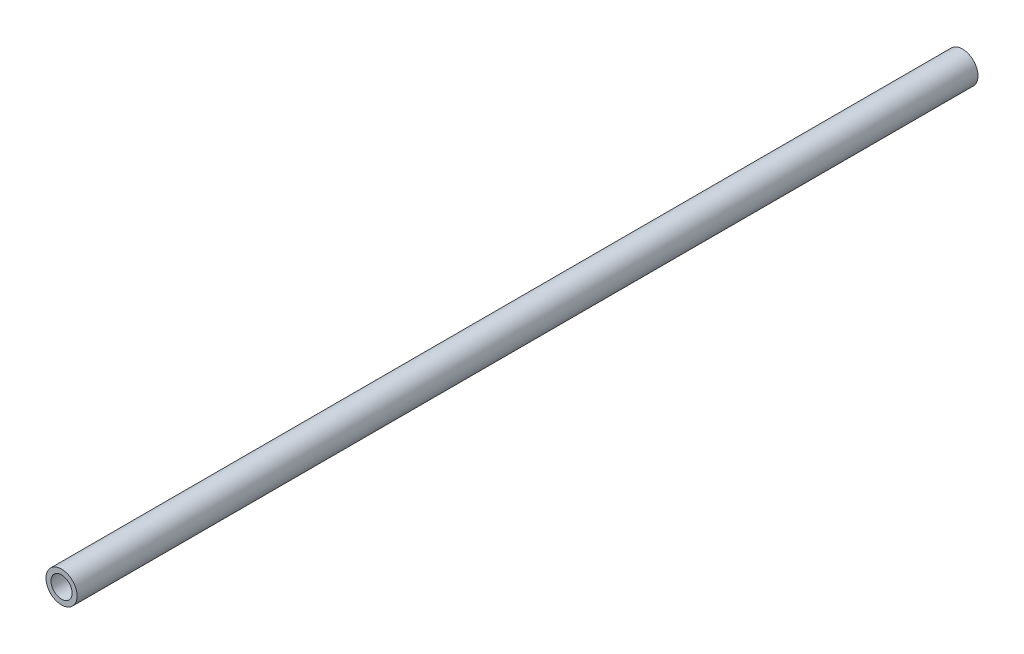
ISO-10303-21;
HEADER;
FILE_DESCRIPTION(('STEP AP214'),'2;1');
FILE_NAME('part.step','',(''),(''),'','','');
FILE_SCHEMA(('AUTOMOTIVE_DESIGN { 1 0 10303 214 1 1 1 1 }'));
ENDSEC;
DATA;
#1=APPLICATION_CONTEXT('core data for automotive mechanical design processes');
#2=APPLICATION_PROTOCOL_DEFINITION('international standard','automotive_design',2000,#1);
#3=PRODUCT_CONTEXT('',#1,'mechanical');
#4=PRODUCT('Part','Part','',(#3));
#5=PRODUCT_RELATED_PRODUCT_CATEGORY('part','',(#4));
#6=PRODUCT_DEFINITION_FORMATION('','',#4);
#7=PRODUCT_DEFINITION_CONTEXT('part definition',#1,'design');
#8=PRODUCT_DEFINITION('design','',#6,#7);
#9=PRODUCT_DEFINITION_SHAPE('','',#8);
#10=(LENGTH_UNIT() NAMED_UNIT(*) SI_UNIT(.MILLI.,.METRE.));
#11=(NAMED_UNIT(*) PLANE_ANGLE_UNIT() SI_UNIT($,.RADIAN.));
#12=(NAMED_UNIT(*) SI_UNIT($,.STERADIAN.) SOLID_ANGLE_UNIT());
#13=UNCERTAINTY_MEASURE_WITH_UNIT(LENGTH_MEASURE(1.E-05),#10,'distance_accuracy_value','');
#14=(GEOMETRIC_REPRESENTATION_CONTEXT(3) GLOBAL_UNCERTAINTY_ASSIGNED_CONTEXT((#13)) GLOBAL_UNIT_ASSIGNED_CONTEXT((#10,
#11,#12)) REPRESENTATION_CONTEXT('',''));
#15=CARTESIAN_POINT('',(0.,0.,0.));
#16=DIRECTION('',(0.,0.,1.));
#17=DIRECTION('',(1.,0.,0.));
#18=AXIS2_PLACEMENT_3D('',#15,#16,#17);
#19=CARTESIAN_POINT('',(-100.,100.,-240.));
#20=DIRECTION('',(0.,0.,1.));
#21=DIRECTION('',(1.,0.,0.));
#22=AXIS2_PLACEMENT_3D('',#19,#20,#21);
#23=CYLINDRICAL_SURFACE('',#22,3.16358084629656);
#24=CARTESIAN_POINT('',(-100.,100.,-240.));
#25=DIRECTION('',(0.,0.,1.));
#26=DIRECTION('',(1.,0.,0.));
#27=AXIS2_PLACEMENT_3D('',#24,#25,#26);
#28=CIRCLE('',#27,3.16358084629656);
#29=CARTESIAN_POINT('',(-96.8364191537034,100.,-240.));
#30=VERTEX_POINT('',#29);
#31=EDGE_CURVE('E45',#30,#30,#28,.T.);
#32=ORIENTED_EDGE('',*,*,#31,.F.);
#33=EDGE_LOOP('',(#32));
#34=FACE_BOUND('',#33,.T.);
#35=CARTESIAN_POINT('',(-100.,100.,30.));
#36=DIRECTION('',(0.,0.,1.));
#37=DIRECTION('',(1.,0.,0.));
#38=AXIS2_PLACEMENT_3D('',#35,#36,#37);
#39=CIRCLE('',#38,3.16358084629656);
#40=CARTESIAN_POINT('',(-96.8364191537034,100.,30.));
#41=VERTEX_POINT('',#40);
#42=EDGE_CURVE('E53',#41,#41,#39,.T.);
#43=ORIENTED_EDGE('',*,*,#42,.T.);
#44=EDGE_LOOP('',(#43));
#45=FACE_BOUND('',#44,.T.);
#46=ADVANCED_FACE('F39',(#34,#45),#23,.F.);
#47=CARTESIAN_POINT('',(-100.,100.,-240.));
#48=DIRECTION('',(0.,0.,1.));
#49=DIRECTION('',(1.,0.,0.));
#50=AXIS2_PLACEMENT_3D('',#47,#48,#49);
#51=CYLINDRICAL_SURFACE('',#50,4.66358084629657);
#52=CARTESIAN_POINT('',(-100.,100.,-240.));
#53=DIRECTION('',(0.,0.,1.));
#54=DIRECTION('',(1.,0.,0.));
#55=AXIS2_PLACEMENT_3D('',#52,#53,#54);
#56=CIRCLE('',#55,4.66358084629657);
#57=CARTESIAN_POINT('',(-95.3364191537034,100.,-240.));
#58=VERTEX_POINT('',#57);
#59=EDGE_CURVE('E12',#58,#58,#56,.T.);
#60=ORIENTED_EDGE('',*,*,#59,.T.);
#61=EDGE_LOOP('',(#60));
#62=FACE_BOUND('',#61,.T.);
#63=CARTESIAN_POINT('',(-100.,100.,30.));
#64=DIRECTION('',(0.,0.,1.));
#65=DIRECTION('',(1.,0.,0.));
#66=AXIS2_PLACEMENT_3D('',#63,#64,#65);
#67=CIRCLE('',#66,4.66358084629657);
#68=CARTESIAN_POINT('',(-95.3364191537034,100.,30.));
#69=VERTEX_POINT('',#68);
#70=EDGE_CURVE('E49',#69,#69,#67,.T.);
#71=ORIENTED_EDGE('',*,*,#70,.F.);
#72=EDGE_LOOP('',(#71));
#73=FACE_BOUND('',#72,.T.);
#74=ADVANCED_FACE('F67',(#62,#73),#51,.T.);
#75=CARTESIAN_POINT('',(0.,0.,-240.));
#76=DIRECTION('',(0.,0.,1.));
#77=DIRECTION('',(1.,0.,0.));
#78=AXIS2_PLACEMENT_3D('',#75,#76,#77);
#79=PLANE('',#78);
#80=ORIENTED_EDGE('',*,*,#31,.T.);
#81=EDGE_LOOP('',(#80));
#82=FACE_BOUND('',#81,.T.);
#83=ORIENTED_EDGE('',*,*,#59,.F.);
#84=EDGE_LOOP('',(#83));
#85=FACE_BOUND('',#84,.T.);
#86=ADVANCED_FACE('F63',(#82,#85),#79,.F.);
#87=CARTESIAN_POINT('',(0.,0.,30.));
#88=DIRECTION('',(0.,0.,1.));
#89=DIRECTION('',(1.,0.,0.));
#90=AXIS2_PLACEMENT_3D('',#87,#88,#89);
#91=PLANE('',#90);
#92=ORIENTED_EDGE('',*,*,#42,.F.);
#93=EDGE_LOOP('',(#92));
#94=FACE_BOUND('',#93,.T.);
#95=ORIENTED_EDGE('',*,*,#70,.T.);
#96=EDGE_LOOP('',(#95));
#97=FACE_BOUND('',#96,.T.);
#98=ADVANCED_FACE('F60',(#94,#97),#91,.T.);
#99=CLOSED_SHELL('',(#46,#74,#86,#98));
#100=MANIFOLD_SOLID_BREP('B2',#99);
#101=ADVANCED_BREP_SHAPE_REPRESENTATION('',(#18,#100),#14);
#102=SHAPE_DEFINITION_REPRESENTATION(#9,#101);
ENDSEC;
END-ISO-10303-21;
